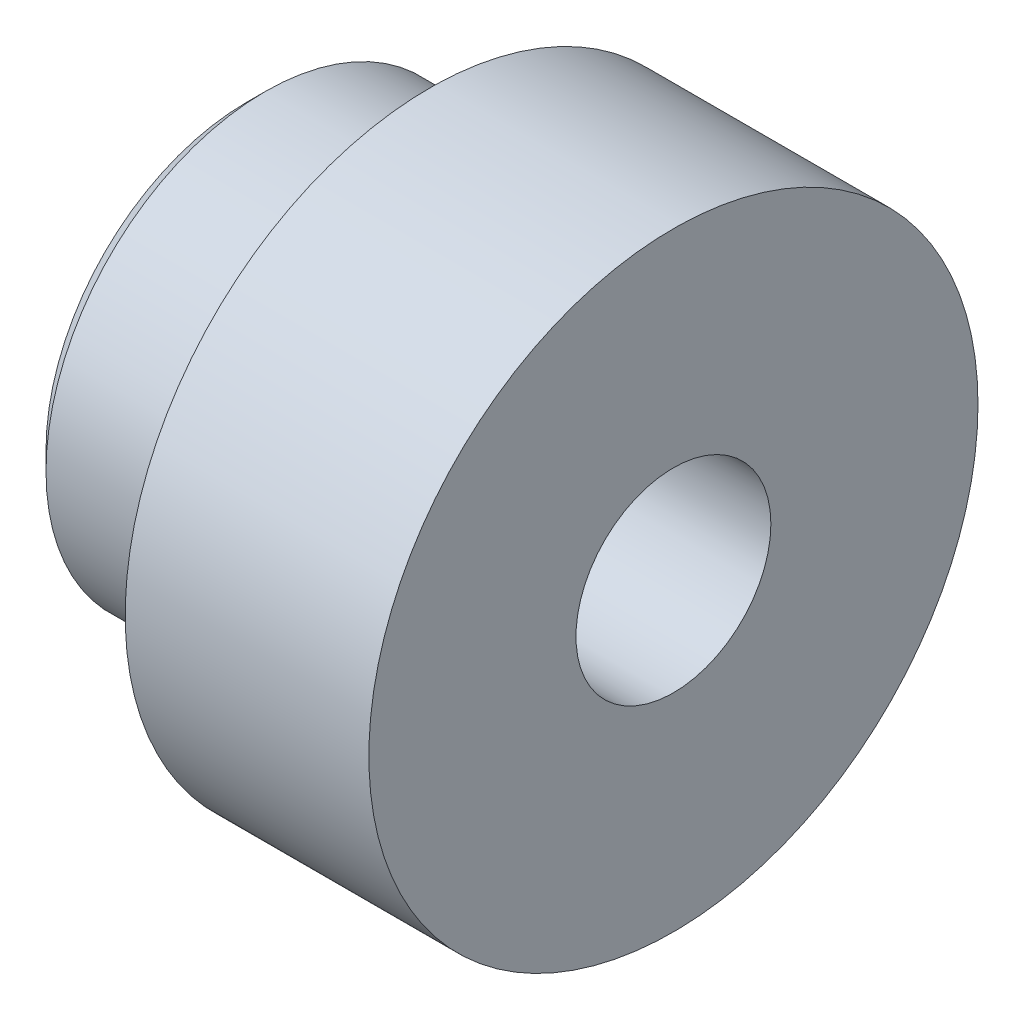
ISO-10303-21;
HEADER;
FILE_DESCRIPTION(('STEP AP214'),'2;1');
FILE_NAME('part.step','',(''),(''),'','','');
FILE_SCHEMA(('AUTOMOTIVE_DESIGN { 1 0 10303 214 1 1 1 1 }'));
ENDSEC;
DATA;
#1=APPLICATION_CONTEXT('core data for automotive mechanical design processes');
#2=APPLICATION_PROTOCOL_DEFINITION('international standard','automotive_design',2000,#1);
#3=PRODUCT_CONTEXT('',#1,'mechanical');
#4=PRODUCT('Part','Part','',(#3));
#5=PRODUCT_RELATED_PRODUCT_CATEGORY('part','',(#4));
#6=PRODUCT_DEFINITION_FORMATION('','',#4);
#7=PRODUCT_DEFINITION_CONTEXT('part definition',#1,'design');
#8=PRODUCT_DEFINITION('design','',#6,#7);
#9=PRODUCT_DEFINITION_SHAPE('','',#8);
#10=(LENGTH_UNIT() NAMED_UNIT(*) SI_UNIT(.MILLI.,.METRE.));
#11=(NAMED_UNIT(*) PLANE_ANGLE_UNIT() SI_UNIT($,.RADIAN.));
#12=(NAMED_UNIT(*) SI_UNIT($,.STERADIAN.) SOLID_ANGLE_UNIT());
#13=UNCERTAINTY_MEASURE_WITH_UNIT(LENGTH_MEASURE(1.E-05),#10,'distance_accuracy_value','');
#14=(GEOMETRIC_REPRESENTATION_CONTEXT(3) GLOBAL_UNCERTAINTY_ASSIGNED_CONTEXT((#13)) GLOBAL_UNIT_ASSIGNED_CONTEXT((#10,
#11,#12)) REPRESENTATION_CONTEXT('',''));
#15=CARTESIAN_POINT('',(0.,0.,0.));
#16=DIRECTION('',(0.,0.,1.));
#17=DIRECTION('',(1.,0.,0.));
#18=AXIS2_PLACEMENT_3D('',#15,#16,#17);
#19=CARTESIAN_POINT('',(-36.4,80.6,0.));
#20=DIRECTION('',(1.,0.,0.));
#21=DIRECTION('',(0.,0.,1.));
#22=AXIS2_PLACEMENT_3D('',#19,#20,#21);
#23=PLANE('',#22);
#24=CARTESIAN_POINT('',(-36.4,80.6,0.));
#25=DIRECTION('',(1.,0.,0.));
#26=DIRECTION('',(0.,0.,-1.));
#27=AXIS2_PLACEMENT_3D('',#24,#25,#26);
#28=CIRCLE('',#27,1.6);
#29=CARTESIAN_POINT('',(-36.4,80.6,-1.6));
#30=VERTEX_POINT('',#29);
#31=EDGE_CURVE('E9',#30,#30,#28,.T.);
#32=ORIENTED_EDGE('',*,*,#31,.F.);
#33=EDGE_LOOP('',(#32));
#34=FACE_BOUND('',#33,.T.);
#35=CARTESIAN_POINT('',(-36.4,80.6,0.));
#36=DIRECTION('',(1.,0.,0.));
#37=DIRECTION('',(0.,0.,-1.));
#38=AXIS2_PLACEMENT_3D('',#35,#36,#37);
#39=CIRCLE('',#38,5.);
#40=CARTESIAN_POINT('',(-36.4,80.6,-5.));
#41=VERTEX_POINT('',#40);
#42=EDGE_CURVE('E90',#41,#41,#39,.T.);
#43=ORIENTED_EDGE('',*,*,#42,.T.);
#44=EDGE_LOOP('',(#43));
#45=FACE_BOUND('',#44,.T.);
#46=ADVANCED_FACE('F14',(#34,#45),#23,.T.);
#47=CARTESIAN_POINT('',(-43.5,80.6,0.));
#48=DIRECTION('',(1.,0.,0.));
#49=DIRECTION('',(0.,0.,-1.));
#50=AXIS2_PLACEMENT_3D('',#47,#48,#49);
#51=CYLINDRICAL_SURFACE('',#50,1.6);
#52=DIRECTION('',(1.,0.,0.));
#53=VECTOR('',#52,1.);
#54=CARTESIAN_POINT('',(-43.5,80.6,-1.6));
#55=LINE('',#54,#53);
#56=CARTESIAN_POINT('',(-43.4,80.6,-1.6));
#57=VERTEX_POINT('',#56);
#58=EDGE_CURVE('E24',#57,#30,#55,.T.);
#59=ORIENTED_EDGE('',*,*,#58,.F.);
#60=CARTESIAN_POINT('',(-43.4,80.6,0.));
#61=DIRECTION('',(1.,0.,0.));
#62=DIRECTION('',(0.,0.,-1.));
#63=AXIS2_PLACEMENT_3D('',#60,#61,#62);
#64=CIRCLE('',#63,1.6);
#65=EDGE_CURVE('E86',#57,#57,#64,.T.);
#66=ORIENTED_EDGE('',*,*,#65,.F.);
#67=ORIENTED_EDGE('',*,*,#58,.T.);
#68=ORIENTED_EDGE('',*,*,#31,.T.);
#69=EDGE_LOOP('',(#59,#66,#67,#68));
#70=FACE_BOUND('',#69,.T.);
#71=ADVANCED_FACE('F97',(#70),#51,.F.);
#72=CARTESIAN_POINT('',(-40.4,80.6,0.));
#73=DIRECTION('',(1.,0.,0.));
#74=DIRECTION('',(0.,0.,-1.));
#75=AXIS2_PLACEMENT_3D('',#72,#73,#74);
#76=CYLINDRICAL_SURFACE('',#75,5.);
#77=ORIENTED_EDGE('',*,*,#42,.F.);
#78=DIRECTION('',(1.,0.,0.));
#79=VECTOR('',#78,1.);
#80=CARTESIAN_POINT('',(-40.4,80.6,-5.));
#81=LINE('',#80,#79);
#82=CARTESIAN_POINT('',(-40.4,80.6,-5.));
#83=VERTEX_POINT('',#82);
#84=EDGE_CURVE('E91',#83,#41,#81,.T.);
#85=ORIENTED_EDGE('',*,*,#84,.F.);
#86=CARTESIAN_POINT('',(-40.4,80.6,0.));
#87=DIRECTION('',(1.,0.,0.));
#88=DIRECTION('',(0.,0.,-1.));
#89=AXIS2_PLACEMENT_3D('',#86,#87,#88);
#90=CIRCLE('',#89,5.);
#91=EDGE_CURVE('E63',#83,#83,#90,.T.);
#92=ORIENTED_EDGE('',*,*,#91,.T.);
#93=ORIENTED_EDGE('',*,*,#84,.T.);
#94=EDGE_LOOP('',(#77,#85,#92,#93));
#95=FACE_BOUND('',#94,.T.);
#96=ADVANCED_FACE('F103',(#95),#76,.T.);
#97=CARTESIAN_POINT('',(-43.4,80.6,0.));
#98=DIRECTION('',(1.,0.,0.));
#99=DIRECTION('',(0.,0.,1.));
#100=AXIS2_PLACEMENT_3D('',#97,#98,#99);
#101=PLANE('',#100);
#102=ORIENTED_EDGE('',*,*,#65,.T.);
#103=EDGE_LOOP('',(#102));
#104=FACE_BOUND('',#103,.T.);
#105=CARTESIAN_POINT('',(-43.4,80.6,0.));
#106=DIRECTION('',(1.,0.,0.));
#107=DIRECTION('',(0.,0.,-1.));
#108=AXIS2_PLACEMENT_3D('',#105,#106,#107);
#109=CIRCLE('',#108,3.3);
#110=CARTESIAN_POINT('',(-43.4,80.6,-3.3));
#111=VERTEX_POINT('',#110);
#112=EDGE_CURVE('E61',#111,#111,#109,.T.);
#113=ORIENTED_EDGE('',*,*,#112,.F.);
#114=EDGE_LOOP('',(#113));
#115=FACE_BOUND('',#114,.T.);
#116=ADVANCED_FACE('F99',(#104,#115),#101,.F.);
#117=CARTESIAN_POINT('',(-40.4,80.6,0.));
#118=DIRECTION('',(1.,0.,0.));
#119=DIRECTION('',(0.,0.,1.));
#120=AXIS2_PLACEMENT_3D('',#117,#118,#119);
#121=PLANE('',#120);
#122=CARTESIAN_POINT('',(-40.4,80.6,0.));
#123=DIRECTION('',(1.,0.,0.));
#124=DIRECTION('',(0.,0.,-1.));
#125=AXIS2_PLACEMENT_3D('',#122,#123,#124);
#126=CIRCLE('',#125,3.6);
#127=CARTESIAN_POINT('',(-40.4,80.6,-3.6));
#128=VERTEX_POINT('',#127);
#129=EDGE_CURVE('E71',#128,#128,#126,.T.);
#130=ORIENTED_EDGE('',*,*,#129,.T.);
#131=EDGE_LOOP('',(#130));
#132=FACE_BOUND('',#131,.T.);
#133=ORIENTED_EDGE('',*,*,#91,.F.);
#134=EDGE_LOOP('',(#133));
#135=FACE_BOUND('',#134,.T.);
#136=ADVANCED_FACE('F102',(#132,#135),#121,.F.);
#137=CARTESIAN_POINT('',(-43.1,80.6,0.));
#138=DIRECTION('',(1.,0.,0.));
#139=DIRECTION('',(0.,0.,-1.));
#140=AXIS2_PLACEMENT_3D('',#137,#138,#139);
#141=CONICAL_SURFACE('',#140,3.6,0.785398163397);
#142=ORIENTED_EDGE('',*,*,#112,.T.);
#143=DIRECTION('',(-0.707106781186548,0.,0.707106781186548));
#144=VECTOR('',#143,1.);
#145=CARTESIAN_POINT('',(-43.1,80.6,-3.6));
#146=LINE('',#145,#144);
#147=CARTESIAN_POINT('',(-43.1,80.6,-3.6));
#148=VERTEX_POINT('',#147);
#149=EDGE_CURVE('E56',#148,#111,#146,.T.);
#150=ORIENTED_EDGE('',*,*,#149,.F.);
#151=CARTESIAN_POINT('',(-43.1,80.6,0.));
#152=DIRECTION('',(1.,0.,0.));
#153=DIRECTION('',(0.,0.,-1.));
#154=AXIS2_PLACEMENT_3D('',#151,#152,#153);
#155=CIRCLE('',#154,3.6);
#156=EDGE_CURVE('E17',#148,#148,#155,.T.);
#157=ORIENTED_EDGE('',*,*,#156,.F.);
#158=ORIENTED_EDGE('',*,*,#149,.T.);
#159=EDGE_LOOP('',(#142,#150,#157,#158));
#160=FACE_BOUND('',#159,.T.);
#161=ADVANCED_FACE('F58',(#160),#141,.T.);
#162=CARTESIAN_POINT('',(-43.4,80.6,0.));
#163=DIRECTION('',(1.,0.,0.));
#164=DIRECTION('',(0.,0.,-1.));
#165=AXIS2_PLACEMENT_3D('',#162,#163,#164);
#166=CYLINDRICAL_SURFACE('',#165,3.6);
#167=DIRECTION('',(1.,0.,0.));
#168=VECTOR('',#167,1.);
#169=CARTESIAN_POINT('',(-43.4,80.6,-3.6));
#170=LINE('',#169,#168);
#171=EDGE_CURVE('E69',#148,#128,#170,.T.);
#172=ORIENTED_EDGE('',*,*,#171,.T.);
#173=ORIENTED_EDGE('',*,*,#129,.F.);
#174=ORIENTED_EDGE('',*,*,#171,.F.);
#175=ORIENTED_EDGE('',*,*,#156,.T.);
#176=EDGE_LOOP('',(#172,#173,#174,#175));
#177=FACE_BOUND('',#176,.T.);
#178=ADVANCED_FACE('F67',(#177),#166,.T.);
#179=CLOSED_SHELL('',(#46,#71,#96,#116,#136,#161,#178));
#180=MANIFOLD_SOLID_BREP('B1',#179);
#181=ADVANCED_BREP_SHAPE_REPRESENTATION('',(#18,#180),#14);
#182=SHAPE_DEFINITION_REPRESENTATION(#9,#181);
ENDSEC;
END-ISO-10303-21;
